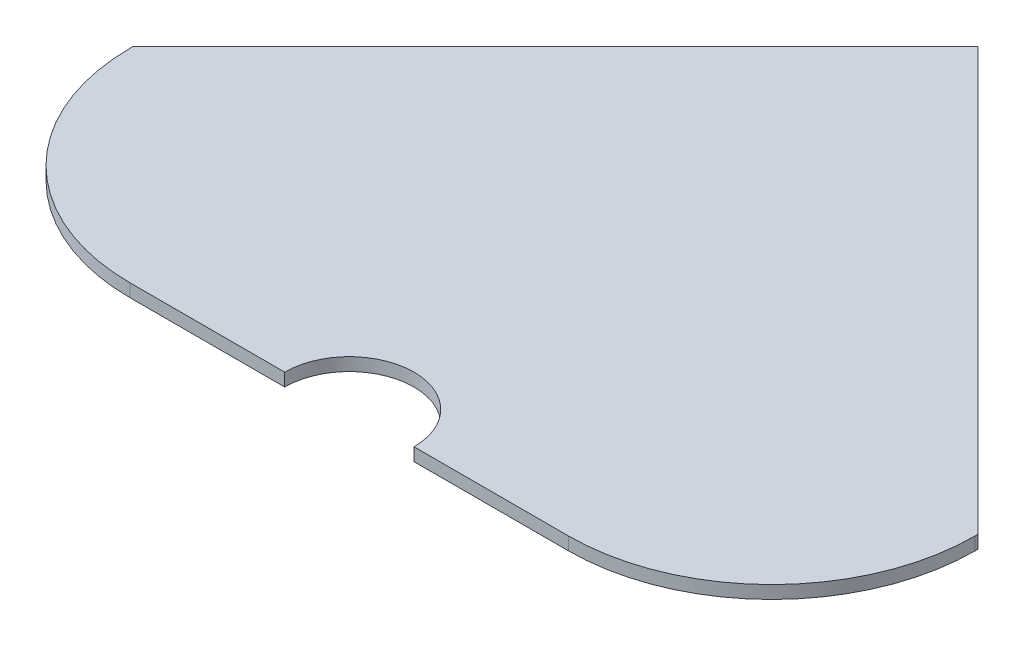
ISO-10303-21;
HEADER;
FILE_DESCRIPTION(('STEP AP214'),'2;1');
FILE_NAME('part.step','',(''),(''),'','','');
FILE_SCHEMA(('AUTOMOTIVE_DESIGN { 1 0 10303 214 1 1 1 1 }'));
ENDSEC;
DATA;
#1=APPLICATION_CONTEXT('core data for automotive mechanical design processes');
#2=APPLICATION_PROTOCOL_DEFINITION('international standard','automotive_design',2000,#1);
#3=PRODUCT_CONTEXT('',#1,'mechanical');
#4=PRODUCT('Part','Part','',(#3));
#5=PRODUCT_RELATED_PRODUCT_CATEGORY('part','',(#4));
#6=PRODUCT_DEFINITION_FORMATION('','',#4);
#7=PRODUCT_DEFINITION_CONTEXT('part definition',#1,'design');
#8=PRODUCT_DEFINITION('design','',#6,#7);
#9=PRODUCT_DEFINITION_SHAPE('','',#8);
#10=(LENGTH_UNIT() NAMED_UNIT(*) SI_UNIT(.MILLI.,.METRE.));
#11=(NAMED_UNIT(*) PLANE_ANGLE_UNIT() SI_UNIT($,.RADIAN.));
#12=(NAMED_UNIT(*) SI_UNIT($,.STERADIAN.) SOLID_ANGLE_UNIT());
#13=UNCERTAINTY_MEASURE_WITH_UNIT(LENGTH_MEASURE(1.E-05),#10,'distance_accuracy_value','');
#14=(GEOMETRIC_REPRESENTATION_CONTEXT(3) GLOBAL_UNCERTAINTY_ASSIGNED_CONTEXT((#13)) GLOBAL_UNIT_ASSIGNED_CONTEXT((#10,
#11,#12)) REPRESENTATION_CONTEXT('',''));
#15=CARTESIAN_POINT('',(0.,0.,0.));
#16=DIRECTION('',(0.,0.,1.));
#17=DIRECTION('',(1.,0.,0.));
#18=AXIS2_PLACEMENT_3D('',#15,#16,#17);
#19=CARTESIAN_POINT('',(-50.8499999999997,3.,23.925));
#20=DIRECTION('',(0.,0.,-1.));
#21=DIRECTION('',(-1.,0.,0.));
#22=AXIS2_PLACEMENT_3D('',#19,#20,#21);
#23=PLANE('',#22);
#24=DIRECTION('',(1.,0.,0.));
#25=VECTOR('',#24,1.);
#26=CARTESIAN_POINT('',(-50.8499999999997,0.,23.925));
#27=LINE('',#26,#25);
#28=CARTESIAN_POINT('',(-50.8499999999997,0.,23.925));
#29=VERTEX_POINT('',#28);
#30=CARTESIAN_POINT('',(-15.,0.,23.925));
#31=VERTEX_POINT('',#30);
#32=EDGE_CURVE('E147',#29,#31,#27,.T.);
#33=ORIENTED_EDGE('',*,*,#32,.T.);
#34=DIRECTION('',(0.,1.,0.));
#35=VECTOR('',#34,1.);
#36=CARTESIAN_POINT('',(-15.,0.,23.925));
#37=LINE('',#36,#35);
#38=CARTESIAN_POINT('',(-15.,3.,23.925));
#39=VERTEX_POINT('',#38);
#40=EDGE_CURVE('E47',#31,#39,#37,.T.);
#41=ORIENTED_EDGE('',*,*,#40,.T.);
#42=DIRECTION('',(1.,0.,0.));
#43=VECTOR('',#42,1.);
#44=CARTESIAN_POINT('',(-50.8499999999997,3.,23.925));
#45=LINE('',#44,#43);
#46=CARTESIAN_POINT('',(-50.8499999999997,3.,23.925));
#47=VERTEX_POINT('',#46);
#48=EDGE_CURVE('E118',#47,#39,#45,.T.);
#49=ORIENTED_EDGE('',*,*,#48,.F.);
#50=DIRECTION('',(0.,-1.,0.));
#51=VECTOR('',#50,1.);
#52=CARTESIAN_POINT('',(-50.8499999999997,3.,23.925));
#53=LINE('',#52,#51);
#54=EDGE_CURVE('E128',#47,#29,#53,.T.);
#55=ORIENTED_EDGE('',*,*,#54,.T.);
#56=EDGE_LOOP('',(#33,#41,#49,#55));
#57=FACE_BOUND('',#56,.T.);
#58=ADVANCED_FACE('F32',(#57),#23,.F.);
#59=CARTESIAN_POINT('',(-3.81639164714898E-13,3.,-121.925));
#60=DIRECTION('',(-0.707106781186546,0.,0.707106781186549));
#61=DIRECTION('',(0.707106781186549,0.,0.707106781186546));
#62=AXIS2_PLACEMENT_3D('',#59,#60,#61);
#63=PLANE('',#62);
#64=DIRECTION('',(-0.707106781186549,0.,-0.707106781186546));
#65=VECTOR('',#64,1.);
#66=CARTESIAN_POINT('',(-3.81639164714898E-13,0.,-121.925));
#67=LINE('',#66,#65);
#68=CARTESIAN_POINT('',(98.,0.,-23.925));
#69=VERTEX_POINT('',#68);
#70=CARTESIAN_POINT('',(-3.81639164714898E-13,0.,-121.925));
#71=VERTEX_POINT('',#70);
#72=EDGE_CURVE('E137',#69,#71,#67,.T.);
#73=ORIENTED_EDGE('',*,*,#72,.T.);
#74=DIRECTION('',(0.,-1.,0.));
#75=VECTOR('',#74,1.);
#76=CARTESIAN_POINT('',(-3.81639164714898E-13,3.,-121.925));
#77=LINE('',#76,#75);
#78=CARTESIAN_POINT('',(-3.81639164714898E-13,3.,-121.925));
#79=VERTEX_POINT('',#78);
#80=EDGE_CURVE('E11',#79,#71,#77,.T.);
#81=ORIENTED_EDGE('',*,*,#80,.F.);
#82=DIRECTION('',(-0.707106781186549,0.,-0.707106781186546));
#83=VECTOR('',#82,1.);
#84=CARTESIAN_POINT('',(-3.81639164714898E-13,3.,-121.925));
#85=LINE('',#84,#83);
#86=CARTESIAN_POINT('',(98.,3.,-23.925));
#87=VERTEX_POINT('',#86);
#88=EDGE_CURVE('E153',#87,#79,#85,.T.);
#89=ORIENTED_EDGE('',*,*,#88,.F.);
#90=DIRECTION('',(0.,-1.,0.));
#91=VECTOR('',#90,1.);
#92=CARTESIAN_POINT('',(98.,3.,-23.925));
#93=LINE('',#92,#91);
#94=EDGE_CURVE('E133',#87,#69,#93,.T.);
#95=ORIENTED_EDGE('',*,*,#94,.T.);
#96=EDGE_LOOP('',(#73,#81,#89,#95));
#97=FACE_BOUND('',#96,.T.);
#98=ADVANCED_FACE('F34',(#97),#63,.F.);
#99=CARTESIAN_POINT('',(-98.,3.,-23.925));
#100=DIRECTION('',(0.707106781186549,0.,0.707106781186546));
#101=DIRECTION('',(0.707106781186546,0.,-0.707106781186549));
#102=AXIS2_PLACEMENT_3D('',#99,#100,#101);
#103=PLANE('',#102);
#104=DIRECTION('',(-0.707106781186546,0.,0.707106781186549));
#105=VECTOR('',#104,1.);
#106=CARTESIAN_POINT('',(-98.,0.,-23.925));
#107=LINE('',#106,#105);
#108=CARTESIAN_POINT('',(-98.,0.,-23.925));
#109=VERTEX_POINT('',#108);
#110=EDGE_CURVE('E140',#71,#109,#107,.T.);
#111=ORIENTED_EDGE('',*,*,#110,.T.);
#112=DIRECTION('',(0.,-1.,0.));
#113=VECTOR('',#112,1.);
#114=CARTESIAN_POINT('',(-98.,3.,-23.925));
#115=LINE('',#114,#113);
#116=CARTESIAN_POINT('',(-98.,3.,-23.925));
#117=VERTEX_POINT('',#116);
#118=EDGE_CURVE('E40',#117,#109,#115,.T.);
#119=ORIENTED_EDGE('',*,*,#118,.F.);
#120=DIRECTION('',(-0.707106781186546,0.,0.707106781186549));
#121=VECTOR('',#120,1.);
#122=CARTESIAN_POINT('',(-98.,3.,-23.925));
#123=LINE('',#122,#121);
#124=EDGE_CURVE('E94',#79,#117,#123,.T.);
#125=ORIENTED_EDGE('',*,*,#124,.F.);
#126=ORIENTED_EDGE('',*,*,#80,.T.);
#127=EDGE_LOOP('',(#111,#119,#125,#126));
#128=FACE_BOUND('',#127,.T.);
#129=ADVANCED_FACE('F194',(#128),#103,.F.);
#130=CARTESIAN_POINT('',(-98.,3.,-23.2250000000003));
#131=DIRECTION('',(1.,0.,0.));
#132=DIRECTION('',(0.,0.,-1.));
#133=AXIS2_PLACEMENT_3D('',#130,#131,#132);
#134=PLANE('',#133);
#135=DIRECTION('',(0.,0.,1.));
#136=VECTOR('',#135,1.);
#137=CARTESIAN_POINT('',(-98.,0.,-23.2250000000003));
#138=LINE('',#137,#136);
#139=CARTESIAN_POINT('',(-98.,0.,-23.2250000000003));
#140=VERTEX_POINT('',#139);
#141=EDGE_CURVE('E143',#109,#140,#138,.T.);
#142=ORIENTED_EDGE('',*,*,#141,.T.);
#143=DIRECTION('',(0.,-1.,0.));
#144=VECTOR('',#143,1.);
#145=CARTESIAN_POINT('',(-98.,3.,-23.2250000000003));
#146=LINE('',#145,#144);
#147=CARTESIAN_POINT('',(-98.,3.,-23.2250000000003));
#148=VERTEX_POINT('',#147);
#149=EDGE_CURVE('E158',#148,#140,#146,.T.);
#150=ORIENTED_EDGE('',*,*,#149,.F.);
#151=DIRECTION('',(0.,0.,1.));
#152=VECTOR('',#151,1.);
#153=CARTESIAN_POINT('',(-98.,3.,-23.2250000000003));
#154=LINE('',#153,#152);
#155=EDGE_CURVE('E166',#117,#148,#154,.T.);
#156=ORIENTED_EDGE('',*,*,#155,.F.);
#157=ORIENTED_EDGE('',*,*,#118,.T.);
#158=EDGE_LOOP('',(#142,#150,#156,#157));
#159=FACE_BOUND('',#158,.T.);
#160=ADVANCED_FACE('F164',(#159),#134,.F.);
#161=CARTESIAN_POINT('',(-50.85,3.,-23.225));
#162=DIRECTION('',(0.,-1.,0.));
#163=DIRECTION('',(0.,0.,-1.));
#164=AXIS2_PLACEMENT_3D('',#161,#162,#163);
#165=CYLINDRICAL_SURFACE('',#164,47.15);
#166=CARTESIAN_POINT('',(-50.85,0.,-23.225));
#167=DIRECTION('',(0.,1.,0.));
#168=DIRECTION('',(0.,0.,-1.));
#169=AXIS2_PLACEMENT_3D('',#166,#167,#168);
#170=CIRCLE('',#169,47.15);
#171=EDGE_CURVE('E145',#140,#29,#170,.T.);
#172=ORIENTED_EDGE('',*,*,#171,.T.);
#173=ORIENTED_EDGE('',*,*,#54,.F.);
#174=CARTESIAN_POINT('',(-50.85,3.,-23.225));
#175=DIRECTION('',(0.,1.,0.));
#176=DIRECTION('',(0.,0.,-1.));
#177=AXIS2_PLACEMENT_3D('',#174,#175,#176);
#178=CIRCLE('',#177,47.15);
#179=EDGE_CURVE('E119',#148,#47,#178,.T.);
#180=ORIENTED_EDGE('',*,*,#179,.F.);
#181=ORIENTED_EDGE('',*,*,#149,.T.);
#182=EDGE_LOOP('',(#172,#173,#180,#181));
#183=FACE_BOUND('',#182,.T.);
#184=ADVANCED_FACE('F174',(#183),#165,.T.);
#185=CARTESIAN_POINT('',(15.,3.,23.925));
#186=VERTEX_POINT('',#185);
#187=CARTESIAN_POINT('',(50.8499999999997,3.,23.925));
#188=VERTEX_POINT('',#187);
#189=EDGE_CURVE('E108',#186,#188,#45,.T.);
#190=ORIENTED_EDGE('',*,*,#189,.F.);
#191=DIRECTION('',(0.,1.,0.));
#192=VECTOR('',#191,1.);
#193=CARTESIAN_POINT('',(15.,0.,23.925));
#194=LINE('',#193,#192);
#195=CARTESIAN_POINT('',(15.,0.,23.925));
#196=VERTEX_POINT('',#195);
#197=EDGE_CURVE('E141',#196,#186,#194,.T.);
#198=ORIENTED_EDGE('',*,*,#197,.F.);
#199=CARTESIAN_POINT('',(50.8499999999997,0.,23.925));
#200=VERTEX_POINT('',#199);
#201=EDGE_CURVE('E125',#196,#200,#27,.T.);
#202=ORIENTED_EDGE('',*,*,#201,.T.);
#203=DIRECTION('',(0.,-1.,0.));
#204=VECTOR('',#203,1.);
#205=CARTESIAN_POINT('',(50.8499999999997,3.,23.925));
#206=LINE('',#205,#204);
#207=EDGE_CURVE('E122',#188,#200,#206,.T.);
#208=ORIENTED_EDGE('',*,*,#207,.F.);
#209=EDGE_LOOP('',(#190,#198,#202,#208));
#210=FACE_BOUND('',#209,.T.);
#211=ADVANCED_FACE('F123',(#210),#23,.F.);
#212=CARTESIAN_POINT('',(50.85,3.,-23.225));
#213=DIRECTION('',(0.,-1.,0.));
#214=DIRECTION('',(0.,0.,-1.));
#215=AXIS2_PLACEMENT_3D('',#212,#213,#214);
#216=CYLINDRICAL_SURFACE('',#215,47.15);
#217=CARTESIAN_POINT('',(50.85,0.,-23.225));
#218=DIRECTION('',(0.,1.,0.));
#219=DIRECTION('',(0.,0.,1.));
#220=AXIS2_PLACEMENT_3D('',#217,#218,#219);
#221=CIRCLE('',#220,47.15);
#222=CARTESIAN_POINT('',(98.,0.,-23.2250000000003));
#223=VERTEX_POINT('',#222);
#224=EDGE_CURVE('E150',#200,#223,#221,.T.);
#225=ORIENTED_EDGE('',*,*,#224,.T.);
#226=DIRECTION('',(0.,-1.,0.));
#227=VECTOR('',#226,1.);
#228=CARTESIAN_POINT('',(98.,3.,-23.2250000000003));
#229=LINE('',#228,#227);
#230=CARTESIAN_POINT('',(98.,3.,-23.2250000000003));
#231=VERTEX_POINT('',#230);
#232=EDGE_CURVE('E129',#231,#223,#229,.T.);
#233=ORIENTED_EDGE('',*,*,#232,.F.);
#234=CARTESIAN_POINT('',(50.85,3.,-23.225));
#235=DIRECTION('',(0.,1.,0.));
#236=DIRECTION('',(0.,0.,1.));
#237=AXIS2_PLACEMENT_3D('',#234,#235,#236);
#238=CIRCLE('',#237,47.15);
#239=EDGE_CURVE('E112',#188,#231,#238,.T.);
#240=ORIENTED_EDGE('',*,*,#239,.F.);
#241=ORIENTED_EDGE('',*,*,#207,.T.);
#242=EDGE_LOOP('',(#225,#233,#240,#241));
#243=FACE_BOUND('',#242,.T.);
#244=ADVANCED_FACE('F131',(#243),#216,.T.);
#245=CARTESIAN_POINT('',(98.,3.,-23.2250000000003));
#246=DIRECTION('',(-1.,0.,0.));
#247=DIRECTION('',(0.,0.,1.));
#248=AXIS2_PLACEMENT_3D('',#245,#246,#247);
#249=PLANE('',#248);
#250=DIRECTION('',(0.,0.,-1.));
#251=VECTOR('',#250,1.);
#252=CARTESIAN_POINT('',(98.,0.,-23.2250000000003));
#253=LINE('',#252,#251);
#254=EDGE_CURVE('E86',#223,#69,#253,.T.);
#255=ORIENTED_EDGE('',*,*,#254,.T.);
#256=ORIENTED_EDGE('',*,*,#94,.F.);
#257=DIRECTION('',(0.,0.,-1.));
#258=VECTOR('',#257,1.);
#259=CARTESIAN_POINT('',(98.,3.,-23.2250000000003));
#260=LINE('',#259,#258);
#261=EDGE_CURVE('E56',#231,#87,#260,.T.);
#262=ORIENTED_EDGE('',*,*,#261,.F.);
#263=ORIENTED_EDGE('',*,*,#232,.T.);
#264=EDGE_LOOP('',(#255,#256,#262,#263));
#265=FACE_BOUND('',#264,.T.);
#266=ADVANCED_FACE('F185',(#265),#249,.F.);
#267=CARTESIAN_POINT('',(50.85,3.,-23.225));
#268=DIRECTION('',(0.,1.,0.));
#269=DIRECTION('',(0.,0.,1.));
#270=AXIS2_PLACEMENT_3D('',#267,#268,#269);
#271=PLANE('',#270);
#272=CARTESIAN_POINT('',(0.,3.,23.925));
#273=DIRECTION('',(0.,1.,0.));
#274=DIRECTION('',(0.,0.,-1.));
#275=AXIS2_PLACEMENT_3D('',#272,#273,#274);
#276=CIRCLE('',#275,15.);
#277=EDGE_CURVE('E115',#186,#39,#276,.T.);
#278=ORIENTED_EDGE('',*,*,#277,.F.);
#279=ORIENTED_EDGE('',*,*,#189,.T.);
#280=ORIENTED_EDGE('',*,*,#239,.T.);
#281=ORIENTED_EDGE('',*,*,#261,.T.);
#282=ORIENTED_EDGE('',*,*,#88,.T.);
#283=ORIENTED_EDGE('',*,*,#124,.T.);
#284=ORIENTED_EDGE('',*,*,#155,.T.);
#285=ORIENTED_EDGE('',*,*,#179,.T.);
#286=ORIENTED_EDGE('',*,*,#48,.T.);
#287=EDGE_LOOP('',(#278,#279,#280,#281,#282,#283,#284,#285,#286));
#288=FACE_BOUND('',#287,.T.);
#289=ADVANCED_FACE('F110',(#288),#271,.T.);
#290=CARTESIAN_POINT('',(50.85,0.,-23.225));
#291=DIRECTION('',(0.,1.,0.));
#292=DIRECTION('',(0.,0.,1.));
#293=AXIS2_PLACEMENT_3D('',#290,#291,#292);
#294=PLANE('',#293);
#295=ORIENTED_EDGE('',*,*,#201,.F.);
#296=CARTESIAN_POINT('',(0.,0.,23.925));
#297=DIRECTION('',(0.,1.,0.));
#298=DIRECTION('',(0.,0.,-1.));
#299=AXIS2_PLACEMENT_3D('',#296,#297,#298);
#300=CIRCLE('',#299,15.);
#301=EDGE_CURVE('E181',#196,#31,#300,.T.);
#302=ORIENTED_EDGE('',*,*,#301,.T.);
#303=ORIENTED_EDGE('',*,*,#32,.F.);
#304=ORIENTED_EDGE('',*,*,#171,.F.);
#305=ORIENTED_EDGE('',*,*,#141,.F.);
#306=ORIENTED_EDGE('',*,*,#110,.F.);
#307=ORIENTED_EDGE('',*,*,#72,.F.);
#308=ORIENTED_EDGE('',*,*,#254,.F.);
#309=ORIENTED_EDGE('',*,*,#224,.F.);
#310=EDGE_LOOP('',(#295,#302,#303,#304,#305,#306,#307,#308,#309));
#311=FACE_BOUND('',#310,.T.);
#312=ADVANCED_FACE('F169',(#311),#294,.F.);
#313=CARTESIAN_POINT('',(0.,0.,23.925));
#314=DIRECTION('',(0.,1.,0.));
#315=DIRECTION('',(0.,0.,1.));
#316=AXIS2_PLACEMENT_3D('',#313,#314,#315);
#317=CYLINDRICAL_SURFACE('',#316,15.);
#318=ORIENTED_EDGE('',*,*,#277,.T.);
#319=ORIENTED_EDGE('',*,*,#40,.F.);
#320=ORIENTED_EDGE('',*,*,#301,.F.);
#321=ORIENTED_EDGE('',*,*,#197,.T.);
#322=EDGE_LOOP('',(#318,#319,#320,#321));
#323=FACE_BOUND('',#322,.T.);
#324=ADVANCED_FACE('F182',(#323),#317,.F.);
#325=CLOSED_SHELL('',(#58,#98,#129,#160,#184,#211,#244,#266,#289,#312,#324));
#326=MANIFOLD_SOLID_BREP('B2',#325);
#327=ADVANCED_BREP_SHAPE_REPRESENTATION('',(#18,#326),#14);
#328=SHAPE_DEFINITION_REPRESENTATION(#9,#327);
ENDSEC;
END-ISO-10303-21;
